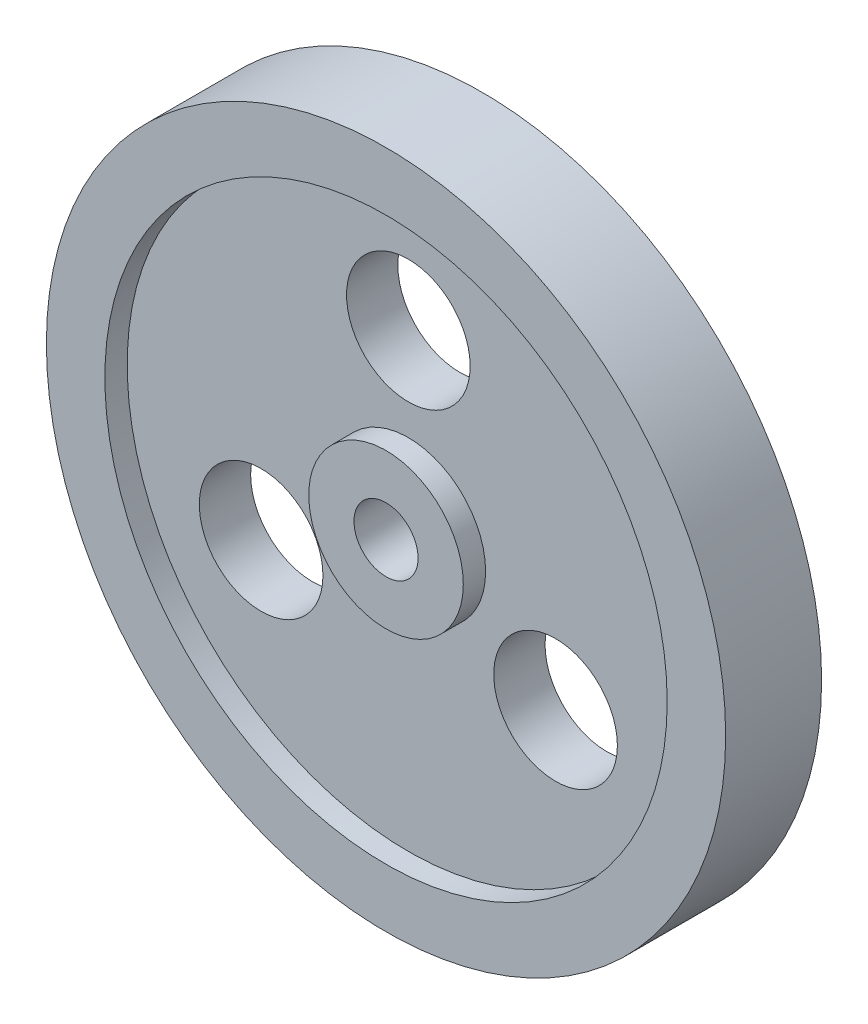
ISO-10303-21;
HEADER;
FILE_DESCRIPTION(('STEP AP214'),'2;1');
FILE_NAME('part.step','',(''),(''),'','','');
FILE_SCHEMA(('AUTOMOTIVE_DESIGN { 1 0 10303 214 1 1 1 1 }'));
ENDSEC;
DATA;
#1=APPLICATION_CONTEXT('core data for automotive mechanical design processes');
#2=APPLICATION_PROTOCOL_DEFINITION('international standard','automotive_design',2000,#1);
#3=PRODUCT_CONTEXT('',#1,'mechanical');
#4=PRODUCT('Part','Part','',(#3));
#5=PRODUCT_RELATED_PRODUCT_CATEGORY('part','',(#4));
#6=PRODUCT_DEFINITION_FORMATION('','',#4);
#7=PRODUCT_DEFINITION_CONTEXT('part definition',#1,'design');
#8=PRODUCT_DEFINITION('design','',#6,#7);
#9=PRODUCT_DEFINITION_SHAPE('','',#8);
#10=(LENGTH_UNIT() NAMED_UNIT(*) SI_UNIT(.MILLI.,.METRE.));
#11=(NAMED_UNIT(*) PLANE_ANGLE_UNIT() SI_UNIT($,.RADIAN.));
#12=(NAMED_UNIT(*) SI_UNIT($,.STERADIAN.) SOLID_ANGLE_UNIT());
#13=UNCERTAINTY_MEASURE_WITH_UNIT(LENGTH_MEASURE(1.E-05),#10,'distance_accuracy_value','');
#14=(GEOMETRIC_REPRESENTATION_CONTEXT(3) GLOBAL_UNCERTAINTY_ASSIGNED_CONTEXT((#13)) GLOBAL_UNIT_ASSIGNED_CONTEXT((#10,
#11,#12)) REPRESENTATION_CONTEXT('',''));
#15=CARTESIAN_POINT('',(0.,0.,0.));
#16=DIRECTION('',(0.,0.,1.));
#17=DIRECTION('',(1.,0.,0.));
#18=AXIS2_PLACEMENT_3D('',#15,#16,#17);
#19=CARTESIAN_POINT('',(0.,0.,-2.794));
#20=DIRECTION('',(0.,0.,1.));
#21=DIRECTION('',(1.,0.,0.));
#22=AXIS2_PLACEMENT_3D('',#19,#20,#21);
#23=PLANE('',#22);
#24=CARTESIAN_POINT('',(0.,0.,-2.794));
#25=DIRECTION('',(0.,0.,1.));
#26=DIRECTION('',(1.,0.,0.));
#27=AXIS2_PLACEMENT_3D('',#24,#25,#26);
#28=CIRCLE('',#27,1.8669);
#29=CARTESIAN_POINT('',(1.8669,0.,-2.794));
#30=VERTEX_POINT('',#29);
#31=EDGE_CURVE('E62',#30,#30,#28,.T.);
#32=ORIENTED_EDGE('',*,*,#31,.T.);
#33=EDGE_LOOP('',(#32));
#34=FACE_BOUND('',#33,.T.);
#35=CARTESIAN_POINT('',(0.,0.,-2.794));
#36=DIRECTION('',(0.,0.,1.));
#37=DIRECTION('',(1.,0.,0.));
#38=AXIS2_PLACEMENT_3D('',#35,#36,#37);
#39=CIRCLE('',#38,4.5);
#40=CARTESIAN_POINT('',(4.5,0.,-2.794));
#41=VERTEX_POINT('',#40);
#42=EDGE_CURVE('E73',#41,#41,#39,.T.);
#43=ORIENTED_EDGE('',*,*,#42,.F.);
#44=EDGE_LOOP('',(#43));
#45=FACE_BOUND('',#44,.T.);
#46=ADVANCED_FACE('F43',(#34,#45),#23,.F.);
#47=CARTESIAN_POINT('',(0.,0.,2.794));
#48=DIRECTION('',(0.,0.,1.));
#49=DIRECTION('',(1.,0.,0.));
#50=AXIS2_PLACEMENT_3D('',#47,#48,#49);
#51=PLANE('',#50);
#52=CARTESIAN_POINT('',(0.,0.,2.794));
#53=DIRECTION('',(0.,0.,1.));
#54=DIRECTION('',(1.,0.,0.));
#55=AXIS2_PLACEMENT_3D('',#52,#53,#54);
#56=CIRCLE('',#55,1.8669);
#57=CARTESIAN_POINT('',(1.8669,0.,2.794));
#58=VERTEX_POINT('',#57);
#59=EDGE_CURVE('E59',#58,#58,#56,.T.);
#60=ORIENTED_EDGE('',*,*,#59,.F.);
#61=EDGE_LOOP('',(#60));
#62=FACE_BOUND('',#61,.T.);
#63=CARTESIAN_POINT('',(0.,0.,2.794));
#64=DIRECTION('',(0.,0.,1.));
#65=DIRECTION('',(1.,0.,0.));
#66=AXIS2_PLACEMENT_3D('',#63,#64,#65);
#67=CIRCLE('',#66,4.5);
#68=CARTESIAN_POINT('',(4.5,0.,2.794));
#69=VERTEX_POINT('',#68);
#70=EDGE_CURVE('E89',#69,#69,#67,.T.);
#71=ORIENTED_EDGE('',*,*,#70,.T.);
#72=EDGE_LOOP('',(#71));
#73=FACE_BOUND('',#72,.T.);
#74=ADVANCED_FACE('F127',(#62,#73),#51,.T.);
#75=CARTESIAN_POINT('',(0.,0.,2.794));
#76=DIRECTION('',(0.,0.,1.));
#77=DIRECTION('',(1.,0.,0.));
#78=AXIS2_PLACEMENT_3D('',#75,#76,#77);
#79=CIRCLE('',#78,16.375);
#80=CARTESIAN_POINT('',(16.375,0.,2.794));
#81=VERTEX_POINT('',#80);
#82=EDGE_CURVE('E95',#81,#81,#79,.T.);
#83=ORIENTED_EDGE('',*,*,#82,.F.);
#84=EDGE_LOOP('',(#83));
#85=FACE_BOUND('',#84,.T.);
#86=CARTESIAN_POINT('',(0.,0.,2.794));
#87=DIRECTION('',(0.,0.,1.));
#88=DIRECTION('',(1.,0.,0.));
#89=AXIS2_PLACEMENT_3D('',#86,#87,#88);
#90=CIRCLE('',#89,19.78095238);
#91=CARTESIAN_POINT('',(19.78095238,0.,2.794));
#92=VERTEX_POINT('',#91);
#93=EDGE_CURVE('E10',#92,#92,#90,.T.);
#94=ORIENTED_EDGE('',*,*,#93,.T.);
#95=EDGE_LOOP('',(#94));
#96=FACE_BOUND('',#95,.T.);
#97=ADVANCED_FACE('F132',(#85,#96),#51,.T.);
#98=CARTESIAN_POINT('',(0.,0.,-2.794));
#99=DIRECTION('',(0.,0.,1.));
#100=DIRECTION('',(1.,0.,0.));
#101=AXIS2_PLACEMENT_3D('',#98,#99,#100);
#102=CIRCLE('',#101,16.375);
#103=CARTESIAN_POINT('',(16.375,0.,-2.794));
#104=VERTEX_POINT('',#103);
#105=EDGE_CURVE('E82',#104,#104,#102,.T.);
#106=ORIENTED_EDGE('',*,*,#105,.T.);
#107=EDGE_LOOP('',(#106));
#108=FACE_BOUND('',#107,.T.);
#109=CARTESIAN_POINT('',(0.,0.,-2.794));
#110=DIRECTION('',(0.,0.,1.));
#111=DIRECTION('',(1.,0.,0.));
#112=AXIS2_PLACEMENT_3D('',#109,#110,#111);
#113=CIRCLE('',#112,19.78095238);
#114=CARTESIAN_POINT('',(19.78095238,0.,-2.794));
#115=VERTEX_POINT('',#114);
#116=EDGE_CURVE('E52',#115,#115,#113,.T.);
#117=ORIENTED_EDGE('',*,*,#116,.F.);
#118=EDGE_LOOP('',(#117));
#119=FACE_BOUND('',#118,.T.);
#120=ADVANCED_FACE('F123',(#108,#119),#23,.F.);
#121=CARTESIAN_POINT('',(0.,0.,2.794));
#122=DIRECTION('',(0.,0.,-1.));
#123=DIRECTION('',(-1.,0.,0.));
#124=AXIS2_PLACEMENT_3D('',#121,#122,#123);
#125=CYLINDRICAL_SURFACE('',#124,19.78095238);
#126=ORIENTED_EDGE('',*,*,#93,.F.);
#127=EDGE_LOOP('',(#126));
#128=FACE_BOUND('',#127,.T.);
#129=ORIENTED_EDGE('',*,*,#116,.T.);
#130=EDGE_LOOP('',(#129));
#131=FACE_BOUND('',#130,.T.);
#132=ADVANCED_FACE('F45',(#128,#131),#125,.T.);
#133=CARTESIAN_POINT('',(0.,0.,2.794));
#134=DIRECTION('',(0.,0.,-1.));
#135=DIRECTION('',(-1.,0.,0.));
#136=AXIS2_PLACEMENT_3D('',#133,#134,#135);
#137=CYLINDRICAL_SURFACE('',#136,1.8669);
#138=ORIENTED_EDGE('',*,*,#59,.T.);
#139=EDGE_LOOP('',(#138));
#140=FACE_BOUND('',#139,.T.);
#141=ORIENTED_EDGE('',*,*,#31,.F.);
#142=EDGE_LOOP('',(#141));
#143=FACE_BOUND('',#142,.T.);
#144=ADVANCED_FACE('F111',(#140,#143),#137,.F.);
#145=CARTESIAN_POINT('',(0.,0.,1.494));
#146=DIRECTION('',(0.,0.,1.));
#147=DIRECTION('',(1.,0.,0.));
#148=AXIS2_PLACEMENT_3D('',#145,#146,#147);
#149=CYLINDRICAL_SURFACE('',#148,16.375);
#150=CARTESIAN_POINT('',(0.,0.,1.494));
#151=DIRECTION('',(0.,0.,1.));
#152=DIRECTION('',(1.,0.,0.));
#153=AXIS2_PLACEMENT_3D('',#150,#151,#152);
#154=CIRCLE('',#153,16.375);
#155=CARTESIAN_POINT('',(16.375,0.,1.494));
#156=VERTEX_POINT('',#155);
#157=EDGE_CURVE('E98',#156,#156,#154,.T.);
#158=ORIENTED_EDGE('',*,*,#157,.F.);
#159=EDGE_LOOP('',(#158));
#160=FACE_BOUND('',#159,.T.);
#161=ORIENTED_EDGE('',*,*,#82,.T.);
#162=EDGE_LOOP('',(#161));
#163=FACE_BOUND('',#162,.T.);
#164=ADVANCED_FACE('F113',(#160,#163),#149,.F.);
#165=CARTESIAN_POINT('',(0.,0.,1.494));
#166=DIRECTION('',(0.,0.,1.));
#167=DIRECTION('',(1.,0.,0.));
#168=AXIS2_PLACEMENT_3D('',#165,#166,#167);
#169=PLANE('',#168);
#170=CARTESIAN_POINT('',(-8.57365149746595,-4.95,1.494));
#171=DIRECTION('',(0.,0.,1.));
#172=DIRECTION('',(1.,0.,0.));
#173=AXIS2_PLACEMENT_3D('',#170,#171,#172);
#174=CIRCLE('',#173,3.6);
#175=CARTESIAN_POINT('',(-4.97365149746594,-4.95,1.494));
#176=VERTEX_POINT('',#175);
#177=EDGE_CURVE('E68',#176,#176,#174,.T.);
#178=ORIENTED_EDGE('',*,*,#177,.F.);
#179=EDGE_LOOP('',(#178));
#180=FACE_BOUND('',#179,.T.);
#181=CARTESIAN_POINT('',(8.57365149746595,-4.95,1.494));
#182=DIRECTION('',(0.,0.,1.));
#183=DIRECTION('',(1.,0.,0.));
#184=AXIS2_PLACEMENT_3D('',#181,#182,#183);
#185=CIRCLE('',#184,3.6);
#186=CARTESIAN_POINT('',(12.1736514974659,-4.95,1.494));
#187=VERTEX_POINT('',#186);
#188=EDGE_CURVE('E173',#187,#187,#185,.T.);
#189=ORIENTED_EDGE('',*,*,#188,.F.);
#190=EDGE_LOOP('',(#189));
#191=FACE_BOUND('',#190,.T.);
#192=CARTESIAN_POINT('',(0.,9.9,1.494));
#193=DIRECTION('',(0.,0.,1.));
#194=DIRECTION('',(1.,0.,0.));
#195=AXIS2_PLACEMENT_3D('',#192,#193,#194);
#196=CIRCLE('',#195,3.6);
#197=CARTESIAN_POINT('',(3.6,9.9,1.494));
#198=VERTEX_POINT('',#197);
#199=EDGE_CURVE('E177',#198,#198,#196,.T.);
#200=ORIENTED_EDGE('',*,*,#199,.F.);
#201=EDGE_LOOP('',(#200));
#202=FACE_BOUND('',#201,.T.);
#203=CARTESIAN_POINT('',(0.,0.,1.494));
#204=DIRECTION('',(0.,0.,1.));
#205=DIRECTION('',(1.,0.,0.));
#206=AXIS2_PLACEMENT_3D('',#203,#204,#205);
#207=CIRCLE('',#206,4.5);
#208=CARTESIAN_POINT('',(4.5,0.,1.494));
#209=VERTEX_POINT('',#208);
#210=EDGE_CURVE('E92',#209,#209,#207,.T.);
#211=ORIENTED_EDGE('',*,*,#210,.F.);
#212=EDGE_LOOP('',(#211));
#213=FACE_BOUND('',#212,.T.);
#214=ORIENTED_EDGE('',*,*,#157,.T.);
#215=EDGE_LOOP('',(#214));
#216=FACE_BOUND('',#215,.T.);
#217=ADVANCED_FACE('F120',(#180,#191,#202,#213,#216),#169,.T.);
#218=CARTESIAN_POINT('',(0.,0.,1.494));
#219=DIRECTION('',(0.,0.,1.));
#220=DIRECTION('',(1.,0.,0.));
#221=AXIS2_PLACEMENT_3D('',#218,#219,#220);
#222=CYLINDRICAL_SURFACE('',#221,4.5);
#223=ORIENTED_EDGE('',*,*,#210,.T.);
#224=EDGE_LOOP('',(#223));
#225=FACE_BOUND('',#224,.T.);
#226=ORIENTED_EDGE('',*,*,#70,.F.);
#227=EDGE_LOOP('',(#226));
#228=FACE_BOUND('',#227,.T.);
#229=ADVANCED_FACE('F157',(#225,#228),#222,.T.);
#230=CARTESIAN_POINT('',(0.,0.,-1.494));
#231=DIRECTION('',(0.,0.,-1.));
#232=DIRECTION('',(1.,0.,0.));
#233=AXIS2_PLACEMENT_3D('',#230,#231,#232);
#234=PLANE('',#233);
#235=CARTESIAN_POINT('',(-8.57365149746595,-4.95,-1.494));
#236=DIRECTION('',(0.,0.,-1.));
#237=DIRECTION('',(-1.,0.,0.));
#238=AXIS2_PLACEMENT_3D('',#235,#236,#237);
#239=CIRCLE('',#238,3.6);
#240=CARTESIAN_POINT('',(-12.1736514974659,-4.95,-1.494));
#241=VERTEX_POINT('',#240);
#242=EDGE_CURVE('E47',#241,#241,#239,.T.);
#243=ORIENTED_EDGE('',*,*,#242,.F.);
#244=EDGE_LOOP('',(#243));
#245=FACE_BOUND('',#244,.T.);
#246=CARTESIAN_POINT('',(8.57365149746595,-4.95,-1.494));
#247=DIRECTION('',(0.,0.,-1.));
#248=DIRECTION('',(-1.,0.,0.));
#249=AXIS2_PLACEMENT_3D('',#246,#247,#248);
#250=CIRCLE('',#249,3.6);
#251=CARTESIAN_POINT('',(4.97365149746594,-4.95,-1.494));
#252=VERTEX_POINT('',#251);
#253=EDGE_CURVE('E67',#252,#252,#250,.T.);
#254=ORIENTED_EDGE('',*,*,#253,.F.);
#255=EDGE_LOOP('',(#254));
#256=FACE_BOUND('',#255,.T.);
#257=CARTESIAN_POINT('',(0.,9.9,-1.494));
#258=DIRECTION('',(0.,0.,-1.));
#259=DIRECTION('',(-1.,0.,0.));
#260=AXIS2_PLACEMENT_3D('',#257,#258,#259);
#261=CIRCLE('',#260,3.6);
#262=CARTESIAN_POINT('',(-3.6,9.9,-1.494));
#263=VERTEX_POINT('',#262);
#264=EDGE_CURVE('E65',#263,#263,#261,.T.);
#265=ORIENTED_EDGE('',*,*,#264,.F.);
#266=EDGE_LOOP('',(#265));
#267=FACE_BOUND('',#266,.T.);
#268=CARTESIAN_POINT('',(0.,0.,-1.494));
#269=DIRECTION('',(0.,0.,1.));
#270=DIRECTION('',(1.,0.,0.));
#271=AXIS2_PLACEMENT_3D('',#268,#269,#270);
#272=CIRCLE('',#271,16.375);
#273=CARTESIAN_POINT('',(16.375,0.,-1.494));
#274=VERTEX_POINT('',#273);
#275=EDGE_CURVE('E86',#274,#274,#272,.T.);
#276=ORIENTED_EDGE('',*,*,#275,.F.);
#277=EDGE_LOOP('',(#276));
#278=FACE_BOUND('',#277,.T.);
#279=CARTESIAN_POINT('',(0.,0.,-1.494));
#280=DIRECTION('',(0.,0.,1.));
#281=DIRECTION('',(1.,0.,0.));
#282=AXIS2_PLACEMENT_3D('',#279,#280,#281);
#283=CIRCLE('',#282,4.5);
#284=CARTESIAN_POINT('',(4.5,0.,-1.494));
#285=VERTEX_POINT('',#284);
#286=EDGE_CURVE('E77',#285,#285,#283,.T.);
#287=ORIENTED_EDGE('',*,*,#286,.T.);
#288=EDGE_LOOP('',(#287));
#289=FACE_BOUND('',#288,.T.);
#290=ADVANCED_FACE('F147',(#245,#256,#267,#278,#289),#234,.T.);
#291=CARTESIAN_POINT('',(0.,0.,-1.494));
#292=DIRECTION('',(0.,0.,-1.));
#293=DIRECTION('',(-1.,0.,0.));
#294=AXIS2_PLACEMENT_3D('',#291,#292,#293);
#295=CYLINDRICAL_SURFACE('',#294,16.375);
#296=ORIENTED_EDGE('',*,*,#275,.T.);
#297=EDGE_LOOP('',(#296));
#298=FACE_BOUND('',#297,.T.);
#299=ORIENTED_EDGE('',*,*,#105,.F.);
#300=EDGE_LOOP('',(#299));
#301=FACE_BOUND('',#300,.T.);
#302=ADVANCED_FACE('F145',(#298,#301),#295,.F.);
#303=CARTESIAN_POINT('',(0.,0.,-1.494));
#304=DIRECTION('',(0.,0.,-1.));
#305=DIRECTION('',(-1.,0.,0.));
#306=AXIS2_PLACEMENT_3D('',#303,#304,#305);
#307=CYLINDRICAL_SURFACE('',#306,4.5);
#308=ORIENTED_EDGE('',*,*,#286,.F.);
#309=EDGE_LOOP('',(#308));
#310=FACE_BOUND('',#309,.T.);
#311=ORIENTED_EDGE('',*,*,#42,.T.);
#312=EDGE_LOOP('',(#311));
#313=FACE_BOUND('',#312,.T.);
#314=ADVANCED_FACE('F146',(#310,#313),#307,.T.);
#315=CARTESIAN_POINT('',(0.,9.9,-2.794));
#316=DIRECTION('',(0.,0.,1.));
#317=DIRECTION('',(1.,0.,0.));
#318=AXIS2_PLACEMENT_3D('',#315,#316,#317);
#319=CYLINDRICAL_SURFACE('',#318,3.6);
#320=ORIENTED_EDGE('',*,*,#264,.T.);
#321=EDGE_LOOP('',(#320));
#322=FACE_BOUND('',#321,.T.);
#323=ORIENTED_EDGE('',*,*,#199,.T.);
#324=EDGE_LOOP('',(#323));
#325=FACE_BOUND('',#324,.T.);
#326=ADVANCED_FACE('F153',(#322,#325),#319,.F.);
#327=CARTESIAN_POINT('',(8.57365149746595,-4.95,-2.794));
#328=DIRECTION('',(0.,0.,1.));
#329=DIRECTION('',(1.,0.,0.));
#330=AXIS2_PLACEMENT_3D('',#327,#328,#329);
#331=CYLINDRICAL_SURFACE('',#330,3.6);
#332=ORIENTED_EDGE('',*,*,#253,.T.);
#333=EDGE_LOOP('',(#332));
#334=FACE_BOUND('',#333,.T.);
#335=ORIENTED_EDGE('',*,*,#188,.T.);
#336=EDGE_LOOP('',(#335));
#337=FACE_BOUND('',#336,.T.);
#338=ADVANCED_FACE('F192',(#334,#337),#331,.F.);
#339=CARTESIAN_POINT('',(-8.57365149746595,-4.95,-2.794));
#340=DIRECTION('',(0.,0.,1.));
#341=DIRECTION('',(1.,0.,0.));
#342=AXIS2_PLACEMENT_3D('',#339,#340,#341);
#343=CYLINDRICAL_SURFACE('',#342,3.6);
#344=ORIENTED_EDGE('',*,*,#242,.T.);
#345=EDGE_LOOP('',(#344));
#346=FACE_BOUND('',#345,.T.);
#347=ORIENTED_EDGE('',*,*,#177,.T.);
#348=EDGE_LOOP('',(#347));
#349=FACE_BOUND('',#348,.T.);
#350=ADVANCED_FACE('F190',(#346,#349),#343,.F.);
#351=CLOSED_SHELL('',(#46,#74,#97,#120,#132,#144,#164,#217,#229,#290,#302,#314,#326,#338,#350));
#352=MANIFOLD_SOLID_BREP('B2',#351);
#353=ADVANCED_BREP_SHAPE_REPRESENTATION('',(#18,#352),#14);
#354=SHAPE_DEFINITION_REPRESENTATION(#9,#353);
ENDSEC;
END-ISO-10303-21;
